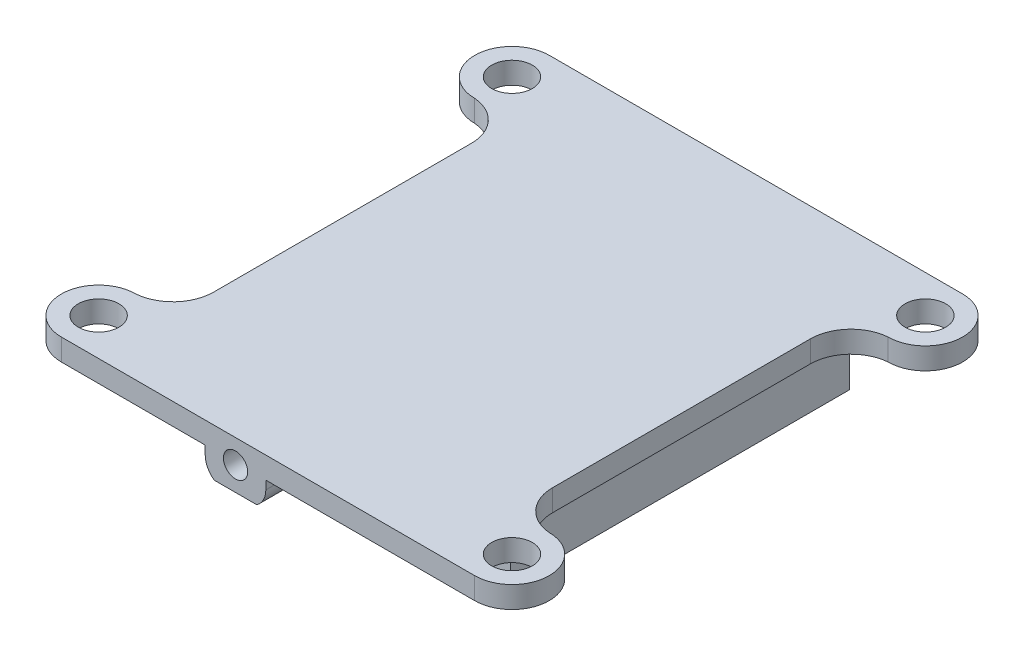
ISO-10303-21;
HEADER;
FILE_DESCRIPTION(('STEP AP214'),'2;1');
FILE_NAME('part.step','',(''),(''),'','','');
FILE_SCHEMA(('AUTOMOTIVE_DESIGN { 1 0 10303 214 1 1 1 1 }'));
ENDSEC;
DATA;
#1=APPLICATION_CONTEXT('core data for automotive mechanical design processes');
#2=APPLICATION_PROTOCOL_DEFINITION('international standard','automotive_design',2000,#1);
#3=PRODUCT_CONTEXT('',#1,'mechanical');
#4=PRODUCT('Part','Part','',(#3));
#5=PRODUCT_RELATED_PRODUCT_CATEGORY('part','',(#4));
#6=PRODUCT_DEFINITION_FORMATION('','',#4);
#7=PRODUCT_DEFINITION_CONTEXT('part definition',#1,'design');
#8=PRODUCT_DEFINITION('design','',#6,#7);
#9=PRODUCT_DEFINITION_SHAPE('','',#8);
#10=(LENGTH_UNIT() NAMED_UNIT(*) SI_UNIT(.MILLI.,.METRE.));
#11=(NAMED_UNIT(*) PLANE_ANGLE_UNIT() SI_UNIT($,.RADIAN.));
#12=(NAMED_UNIT(*) SI_UNIT($,.STERADIAN.) SOLID_ANGLE_UNIT());
#13=UNCERTAINTY_MEASURE_WITH_UNIT(LENGTH_MEASURE(1.E-05),#10,'distance_accuracy_value','');
#14=(GEOMETRIC_REPRESENTATION_CONTEXT(3) GLOBAL_UNCERTAINTY_ASSIGNED_CONTEXT((#13)) GLOBAL_UNIT_ASSIGNED_CONTEXT((#10,
#11,#12)) REPRESENTATION_CONTEXT('',''));
#15=CARTESIAN_POINT('',(0.,0.,0.));
#16=DIRECTION('',(0.,0.,1.));
#17=DIRECTION('',(1.,0.,0.));
#18=AXIS2_PLACEMENT_3D('',#15,#16,#17);
#19=CARTESIAN_POINT('',(0.,-3.2,12.5));
#20=DIRECTION('',(0.,0.,1.));
#21=DIRECTION('',(1.,0.,0.));
#22=AXIS2_PLACEMENT_3D('',#19,#20,#21);
#23=PLANE('',#22);
#24=CARTESIAN_POINT('',(-2.4,-0.15,12.5));
#25=DIRECTION('',(0.,0.,1.));
#26=DIRECTION('',(1.,0.,0.));
#27=AXIS2_PLACEMENT_3D('',#24,#25,#26);
#28=CIRCLE('',#27,0.895817692249954);
#29=CARTESIAN_POINT('',(-1.50418230775005,-0.15,12.5));
#30=VERTEX_POINT('',#29);
#31=EDGE_CURVE('E12',#30,#30,#28,.T.);
#32=ORIENTED_EDGE('',*,*,#31,.T.);
#33=EDGE_LOOP('',(#32));
#34=FACE_BOUND('',#33,.T.);
#35=ADVANCED_FACE('F86',(#34),#23,.T.);
#36=CARTESIAN_POINT('',(0.,0.,0.));
#37=DIRECTION('',(0.,1.,0.));
#38=DIRECTION('',(0.,0.,1.));
#39=AXIS2_PLACEMENT_3D('',#36,#37,#38);
#40=PLANE('',#39);
#41=CARTESIAN_POINT('',(-15.25,0.,15.25));
#42=DIRECTION('',(0.,1.,0.));
#43=DIRECTION('',(0.,0.,1.));
#44=AXIS2_PLACEMENT_3D('',#41,#42,#43);
#45=CIRCLE('',#44,1.5);
#46=CARTESIAN_POINT('',(-15.25,0.,16.75));
#47=VERTEX_POINT('',#46);
#48=EDGE_CURVE('E275',#47,#47,#45,.F.);
#49=ORIENTED_EDGE('',*,*,#48,.F.);
#50=EDGE_LOOP('',(#49));
#51=FACE_BOUND('',#50,.T.);
#52=CARTESIAN_POINT('',(15.25,0.,15.25));
#53=DIRECTION('',(0.,1.,0.));
#54=DIRECTION('',(0.,0.,1.));
#55=AXIS2_PLACEMENT_3D('',#52,#53,#54);
#56=CIRCLE('',#55,1.5);
#57=CARTESIAN_POINT('',(15.25,0.,16.75));
#58=VERTEX_POINT('',#57);
#59=EDGE_CURVE('E272',#58,#58,#56,.T.);
#60=ORIENTED_EDGE('',*,*,#59,.T.);
#61=EDGE_LOOP('',(#60));
#62=FACE_BOUND('',#61,.T.);
#63=CARTESIAN_POINT('',(15.25,0.,-15.25));
#64=DIRECTION('',(0.,1.,0.));
#65=DIRECTION('',(0.,0.,1.));
#66=AXIS2_PLACEMENT_3D('',#63,#64,#65);
#67=CIRCLE('',#66,1.5);
#68=CARTESIAN_POINT('',(15.25,0.,-13.75));
#69=VERTEX_POINT('',#68);
#70=EDGE_CURVE('E269',#69,#69,#67,.F.);
#71=ORIENTED_EDGE('',*,*,#70,.F.);
#72=EDGE_LOOP('',(#71));
#73=FACE_BOUND('',#72,.T.);
#74=CARTESIAN_POINT('',(-15.25,0.,-15.25));
#75=DIRECTION('',(0.,1.,0.));
#76=DIRECTION('',(0.,0.,1.));
#77=AXIS2_PLACEMENT_3D('',#74,#75,#76);
#78=CIRCLE('',#77,1.5);
#79=CARTESIAN_POINT('',(-15.25,0.,-13.75));
#80=VERTEX_POINT('',#79);
#81=EDGE_CURVE('E266',#80,#80,#78,.T.);
#82=ORIENTED_EDGE('',*,*,#81,.T.);
#83=EDGE_LOOP('',(#82));
#84=FACE_BOUND('',#83,.T.);
#85=DIRECTION('',(1.,0.,0.));
#86=VECTOR('',#85,1.);
#87=CARTESIAN_POINT('',(0.,0.,18.));
#88=LINE('',#87,#86);
#89=CARTESIAN_POINT('',(-0.164999999999998,0.,18.));
#90=VERTEX_POINT('',#89);
#91=CARTESIAN_POINT('',(15.25,0.,18.));
#92=VERTEX_POINT('',#91);
#93=EDGE_CURVE('E241',#90,#92,#88,.T.);
#94=ORIENTED_EDGE('',*,*,#93,.F.);
#95=DIRECTION('',(0.,0.,1.));
#96=VECTOR('',#95,1.);
#97=CARTESIAN_POINT('',(-0.164999999999998,0.,6.81660312840991));
#98=LINE('',#97,#96);
#99=CARTESIAN_POINT('',(-0.164999999999998,0.,12.5));
#100=VERTEX_POINT('',#99);
#101=EDGE_CURVE('E385',#100,#90,#98,.T.);
#102=ORIENTED_EDGE('',*,*,#101,.F.);
#103=DIRECTION('',(1.,0.,0.));
#104=VECTOR('',#103,1.);
#105=CARTESIAN_POINT('',(0.,0.,12.5));
#106=LINE('',#105,#104);
#107=CARTESIAN_POINT('',(12.4,0.,12.5));
#108=VERTEX_POINT('',#107);
#109=EDGE_CURVE('E101',#100,#108,#106,.T.);
#110=ORIENTED_EDGE('',*,*,#109,.T.);
#111=DIRECTION('',(0.,0.,1.));
#112=VECTOR('',#111,1.);
#113=CARTESIAN_POINT('',(12.4,0.,0.));
#114=LINE('',#113,#112);
#115=CARTESIAN_POINT('',(12.4,0.,-12.5));
#116=VERTEX_POINT('',#115);
#117=EDGE_CURVE('E412',#116,#108,#114,.T.);
#118=ORIENTED_EDGE('',*,*,#117,.F.);
#119=DIRECTION('',(1.,0.,0.));
#120=VECTOR('',#119,1.);
#121=CARTESIAN_POINT('',(0.,0.,-12.5));
#122=LINE('',#121,#120);
#123=CARTESIAN_POINT('',(-12.4,0.,-12.5));
#124=VERTEX_POINT('',#123);
#125=EDGE_CURVE('E414',#124,#116,#122,.T.);
#126=ORIENTED_EDGE('',*,*,#125,.F.);
#127=DIRECTION('',(0.,0.,1.));
#128=VECTOR('',#127,1.);
#129=CARTESIAN_POINT('',(-12.4,0.,0.));
#130=LINE('',#129,#128);
#131=CARTESIAN_POINT('',(-12.4,0.,12.5));
#132=VERTEX_POINT('',#131);
#133=EDGE_CURVE('E417',#124,#132,#130,.T.);
#134=ORIENTED_EDGE('',*,*,#133,.T.);
#135=CARTESIAN_POINT('',(-4.635,0.,12.5));
#136=VERTEX_POINT('',#135);
#137=EDGE_CURVE('E402',#132,#136,#106,.T.);
#138=ORIENTED_EDGE('',*,*,#137,.T.);
#139=DIRECTION('',(0.,0.,1.));
#140=VECTOR('',#139,1.);
#141=CARTESIAN_POINT('',(-4.635,0.,6.81660312840991));
#142=LINE('',#141,#140);
#143=CARTESIAN_POINT('',(-4.635,0.,18.));
#144=VERTEX_POINT('',#143);
#145=EDGE_CURVE('E382',#136,#144,#142,.T.);
#146=ORIENTED_EDGE('',*,*,#145,.T.);
#147=CARTESIAN_POINT('',(-15.25,0.,18.));
#148=VERTEX_POINT('',#147);
#149=EDGE_CURVE('E242',#148,#144,#88,.T.);
#150=ORIENTED_EDGE('',*,*,#149,.F.);
#151=CARTESIAN_POINT('',(-15.25,0.,15.25));
#152=DIRECTION('',(0.,1.,0.));
#153=DIRECTION('',(0.,0.,1.));
#154=AXIS2_PLACEMENT_3D('',#151,#152,#153);
#155=CIRCLE('',#154,2.75);
#156=CARTESIAN_POINT('',(-15.25,0.,12.5));
#157=VERTEX_POINT('',#156);
#158=EDGE_CURVE('E238',#148,#157,#155,.F.);
#159=ORIENTED_EDGE('',*,*,#158,.T.);
#160=CARTESIAN_POINT('',(-15.5,0.,9.51043481422465));
#161=DIRECTION('',(0.,1.,0.));
#162=DIRECTION('',(0.,0.,1.));
#163=AXIS2_PLACEMENT_3D('',#160,#161,#162);
#164=CIRCLE('',#163,3.);
#165=CARTESIAN_POINT('',(-12.5,0.,9.51043481422465));
#166=VERTEX_POINT('',#165);
#167=EDGE_CURVE('E234',#166,#157,#164,.F.);
#168=ORIENTED_EDGE('',*,*,#167,.F.);
#169=DIRECTION('',(0.,0.,-1.));
#170=VECTOR('',#169,1.);
#171=CARTESIAN_POINT('',(-12.5,0.,0.));
#172=LINE('',#171,#170);
#173=CARTESIAN_POINT('',(-12.5,0.,-9.51043481422465));
#174=VERTEX_POINT('',#173);
#175=EDGE_CURVE('E232',#166,#174,#172,.T.);
#176=ORIENTED_EDGE('',*,*,#175,.T.);
#177=CARTESIAN_POINT('',(-15.5,0.,-9.51043481422465));
#178=DIRECTION('',(0.,1.,0.));
#179=DIRECTION('',(0.,0.,1.));
#180=AXIS2_PLACEMENT_3D('',#177,#178,#179);
#181=CIRCLE('',#180,3.);
#182=CARTESIAN_POINT('',(-15.25,0.,-12.5));
#183=VERTEX_POINT('',#182);
#184=EDGE_CURVE('E263',#174,#183,#181,.T.);
#185=ORIENTED_EDGE('',*,*,#184,.T.);
#186=CARTESIAN_POINT('',(-15.25,0.,-15.25));
#187=DIRECTION('',(0.,1.,0.));
#188=DIRECTION('',(0.,0.,1.));
#189=AXIS2_PLACEMENT_3D('',#186,#187,#188);
#190=CIRCLE('',#189,2.75);
#191=CARTESIAN_POINT('',(-15.25,0.,-18.));
#192=VERTEX_POINT('',#191);
#193=EDGE_CURVE('E261',#192,#183,#190,.T.);
#194=ORIENTED_EDGE('',*,*,#193,.F.);
#195=DIRECTION('',(1.,0.,0.));
#196=VECTOR('',#195,1.);
#197=CARTESIAN_POINT('',(0.,0.,-18.));
#198=LINE('',#197,#196);
#199=CARTESIAN_POINT('',(15.25,0.,-18.));
#200=VERTEX_POINT('',#199);
#201=EDGE_CURVE('E195',#192,#200,#198,.T.);
#202=ORIENTED_EDGE('',*,*,#201,.T.);
#203=CARTESIAN_POINT('',(15.25,0.,-15.25));
#204=DIRECTION('',(0.,1.,0.));
#205=DIRECTION('',(0.,0.,1.));
#206=AXIS2_PLACEMENT_3D('',#203,#204,#205);
#207=CIRCLE('',#206,2.74999999999999);
#208=CARTESIAN_POINT('',(15.25,0.,-12.5));
#209=VERTEX_POINT('',#208);
#210=EDGE_CURVE('E257',#200,#209,#207,.F.);
#211=ORIENTED_EDGE('',*,*,#210,.T.);
#212=CARTESIAN_POINT('',(15.5,0.,-9.51043481422465));
#213=DIRECTION('',(0.,1.,0.));
#214=DIRECTION('',(0.,0.,1.));
#215=AXIS2_PLACEMENT_3D('',#212,#213,#214);
#216=CIRCLE('',#215,3.);
#217=CARTESIAN_POINT('',(12.5,0.,-9.51043481422465));
#218=VERTEX_POINT('',#217);
#219=EDGE_CURVE('E254',#218,#209,#216,.F.);
#220=ORIENTED_EDGE('',*,*,#219,.F.);
#221=DIRECTION('',(0.,0.,-1.));
#222=VECTOR('',#221,1.);
#223=CARTESIAN_POINT('',(12.5,0.,0.));
#224=LINE('',#223,#222);
#225=CARTESIAN_POINT('',(12.5,0.,9.51043481422465));
#226=VERTEX_POINT('',#225);
#227=EDGE_CURVE('E251',#226,#218,#224,.T.);
#228=ORIENTED_EDGE('',*,*,#227,.F.);
#229=CARTESIAN_POINT('',(15.5,0.,9.51043481422465));
#230=DIRECTION('',(0.,1.,0.));
#231=DIRECTION('',(0.,0.,1.));
#232=AXIS2_PLACEMENT_3D('',#229,#230,#231);
#233=CIRCLE('',#232,3.);
#234=CARTESIAN_POINT('',(15.2500000000001,0.,12.5));
#235=VERTEX_POINT('',#234);
#236=EDGE_CURVE('E248',#226,#235,#233,.T.);
#237=ORIENTED_EDGE('',*,*,#236,.T.);
#238=CARTESIAN_POINT('',(15.25,0.,15.25));
#239=DIRECTION('',(0.,1.,0.));
#240=DIRECTION('',(0.,0.,1.));
#241=AXIS2_PLACEMENT_3D('',#238,#239,#240);
#242=CIRCLE('',#241,2.74999999999999);
#243=EDGE_CURVE('E245',#92,#235,#242,.T.);
#244=ORIENTED_EDGE('',*,*,#243,.F.);
#245=EDGE_LOOP('',(#94,#102,#110,#118,#126,#134,#138,#146,#150,#159,#168,#176,#185,#194,#202,
#211,#220,#228,#237,#244));
#246=FACE_BOUND('',#245,.T.);
#247=ADVANCED_FACE('F304',(#51,#62,#73,#84,#246),#40,.F.);
#248=CARTESIAN_POINT('',(-15.25,1.6,15.25));
#249=DIRECTION('',(0.,-1.,0.));
#250=DIRECTION('',(0.,0.,-1.));
#251=AXIS2_PLACEMENT_3D('',#248,#249,#250);
#252=CYLINDRICAL_SURFACE('',#251,1.5);
#253=CARTESIAN_POINT('',(-15.25,1.6,15.25));
#254=DIRECTION('',(0.,1.,0.));
#255=DIRECTION('',(0.,0.,1.));
#256=AXIS2_PLACEMENT_3D('',#253,#254,#255);
#257=CIRCLE('',#256,1.5);
#258=CARTESIAN_POINT('',(-15.25,1.6,16.75));
#259=VERTEX_POINT('',#258);
#260=EDGE_CURVE('E229',#259,#259,#257,.F.);
#261=ORIENTED_EDGE('',*,*,#260,.F.);
#262=EDGE_LOOP('',(#261));
#263=FACE_BOUND('',#262,.T.);
#264=ORIENTED_EDGE('',*,*,#48,.T.);
#265=EDGE_LOOP('',(#264));
#266=FACE_BOUND('',#265,.T.);
#267=ADVANCED_FACE('F323',(#263,#266),#252,.F.);
#268=CARTESIAN_POINT('',(15.25,1.6,15.25));
#269=DIRECTION('',(0.,-1.,0.));
#270=DIRECTION('',(0.,0.,-1.));
#271=AXIS2_PLACEMENT_3D('',#268,#269,#270);
#272=CYLINDRICAL_SURFACE('',#271,1.5);
#273=CARTESIAN_POINT('',(15.25,1.6,15.25));
#274=DIRECTION('',(0.,1.,0.));
#275=DIRECTION('',(0.,0.,1.));
#276=AXIS2_PLACEMENT_3D('',#273,#274,#275);
#277=CIRCLE('',#276,1.5);
#278=CARTESIAN_POINT('',(15.25,1.6,16.75));
#279=VERTEX_POINT('',#278);
#280=EDGE_CURVE('E226',#279,#279,#277,.T.);
#281=ORIENTED_EDGE('',*,*,#280,.T.);
#282=EDGE_LOOP('',(#281));
#283=FACE_BOUND('',#282,.T.);
#284=ORIENTED_EDGE('',*,*,#59,.F.);
#285=EDGE_LOOP('',(#284));
#286=FACE_BOUND('',#285,.T.);
#287=ADVANCED_FACE('F744',(#283,#286),#272,.F.);
#288=CARTESIAN_POINT('',(15.25,1.6,-15.25));
#289=DIRECTION('',(0.,-1.,0.));
#290=DIRECTION('',(0.,0.,-1.));
#291=AXIS2_PLACEMENT_3D('',#288,#289,#290);
#292=CYLINDRICAL_SURFACE('',#291,1.5);
#293=CARTESIAN_POINT('',(15.25,1.6,-15.25));
#294=DIRECTION('',(0.,1.,0.));
#295=DIRECTION('',(0.,0.,1.));
#296=AXIS2_PLACEMENT_3D('',#293,#294,#295);
#297=CIRCLE('',#296,1.5);
#298=CARTESIAN_POINT('',(15.25,1.6,-13.75));
#299=VERTEX_POINT('',#298);
#300=EDGE_CURVE('E223',#299,#299,#297,.F.);
#301=ORIENTED_EDGE('',*,*,#300,.F.);
#302=EDGE_LOOP('',(#301));
#303=FACE_BOUND('',#302,.T.);
#304=ORIENTED_EDGE('',*,*,#70,.T.);
#305=EDGE_LOOP('',(#304));
#306=FACE_BOUND('',#305,.T.);
#307=ADVANCED_FACE('F734',(#303,#306),#292,.F.);
#308=CARTESIAN_POINT('',(-15.25,1.6,-15.25));
#309=DIRECTION('',(0.,-1.,0.));
#310=DIRECTION('',(0.,0.,-1.));
#311=AXIS2_PLACEMENT_3D('',#308,#309,#310);
#312=CYLINDRICAL_SURFACE('',#311,1.5);
#313=CARTESIAN_POINT('',(-15.25,1.6,-15.25));
#314=DIRECTION('',(0.,1.,0.));
#315=DIRECTION('',(0.,0.,1.));
#316=AXIS2_PLACEMENT_3D('',#313,#314,#315);
#317=CIRCLE('',#316,1.5);
#318=CARTESIAN_POINT('',(-15.25,1.6,-13.75));
#319=VERTEX_POINT('',#318);
#320=EDGE_CURVE('E220',#319,#319,#317,.T.);
#321=ORIENTED_EDGE('',*,*,#320,.T.);
#322=EDGE_LOOP('',(#321));
#323=FACE_BOUND('',#322,.T.);
#324=ORIENTED_EDGE('',*,*,#81,.F.);
#325=EDGE_LOOP('',(#324));
#326=FACE_BOUND('',#325,.T.);
#327=ADVANCED_FACE('F726',(#323,#326),#312,.F.);
#328=CARTESIAN_POINT('',(-15.5,1.6,9.51043481422465));
#329=DIRECTION('',(0.,-1.,0.));
#330=DIRECTION('',(0.,0.,-1.));
#331=AXIS2_PLACEMENT_3D('',#328,#329,#330);
#332=CYLINDRICAL_SURFACE('',#331,3.);
#333=ORIENTED_EDGE('',*,*,#167,.T.);
#334=DIRECTION('',(0.,-1.,0.));
#335=VECTOR('',#334,1.);
#336=CARTESIAN_POINT('',(-15.25,1.6,12.5));
#337=LINE('',#336,#335);
#338=CARTESIAN_POINT('',(-15.25,1.6,12.5));
#339=VERTEX_POINT('',#338);
#340=EDGE_CURVE('E296',#339,#157,#337,.T.);
#341=ORIENTED_EDGE('',*,*,#340,.F.);
#342=CARTESIAN_POINT('',(-15.5,1.6,9.51043481422465));
#343=DIRECTION('',(0.,1.,0.));
#344=DIRECTION('',(0.,0.,1.));
#345=AXIS2_PLACEMENT_3D('',#342,#343,#344);
#346=CIRCLE('',#345,3.);
#347=CARTESIAN_POINT('',(-12.5,1.6,9.51043481422465));
#348=VERTEX_POINT('',#347);
#349=EDGE_CURVE('E301',#348,#339,#346,.F.);
#350=ORIENTED_EDGE('',*,*,#349,.F.);
#351=DIRECTION('',(0.,-1.,0.));
#352=VECTOR('',#351,1.);
#353=CARTESIAN_POINT('',(-12.5,1.6,9.51043481422465));
#354=LINE('',#353,#352);
#355=EDGE_CURVE('E94',#348,#166,#354,.T.);
#356=ORIENTED_EDGE('',*,*,#355,.T.);
#357=EDGE_LOOP('',(#333,#341,#350,#356));
#358=FACE_BOUND('',#357,.T.);
#359=ADVANCED_FACE('F299',(#358),#332,.F.);
#360=CARTESIAN_POINT('',(-15.25,1.6,15.25));
#361=DIRECTION('',(0.,-1.,0.));
#362=DIRECTION('',(0.,0.,-1.));
#363=AXIS2_PLACEMENT_3D('',#360,#361,#362);
#364=CYLINDRICAL_SURFACE('',#363,2.75);
#365=ORIENTED_EDGE('',*,*,#158,.F.);
#366=DIRECTION('',(0.,-1.,0.));
#367=VECTOR('',#366,1.);
#368=CARTESIAN_POINT('',(-15.25,1.6,18.));
#369=LINE('',#368,#367);
#370=CARTESIAN_POINT('',(-15.25,1.6,18.));
#371=VERTEX_POINT('',#370);
#372=EDGE_CURVE('E294',#371,#148,#369,.T.);
#373=ORIENTED_EDGE('',*,*,#372,.F.);
#374=CARTESIAN_POINT('',(-15.25,1.6,15.25));
#375=DIRECTION('',(0.,1.,0.));
#376=DIRECTION('',(0.,0.,1.));
#377=AXIS2_PLACEMENT_3D('',#374,#375,#376);
#378=CIRCLE('',#377,2.75);
#379=EDGE_CURVE('E433',#371,#339,#378,.F.);
#380=ORIENTED_EDGE('',*,*,#379,.T.);
#381=ORIENTED_EDGE('',*,*,#340,.T.);
#382=EDGE_LOOP('',(#365,#373,#380,#381));
#383=FACE_BOUND('',#382,.T.);
#384=ADVANCED_FACE('F456',(#383),#364,.T.);
#385=CARTESIAN_POINT('',(0.,1.6,18.));
#386=DIRECTION('',(0.,0.,-1.));
#387=DIRECTION('',(-1.,0.,0.));
#388=AXIS2_PLACEMENT_3D('',#385,#386,#387);
#389=PLANE('',#388);
#390=CARTESIAN_POINT('',(-2.4,-0.15,18.));
#391=DIRECTION('',(0.,0.,1.));
#392=DIRECTION('',(1.,0.,0.));
#393=AXIS2_PLACEMENT_3D('',#390,#391,#392);
#394=CIRCLE('',#393,0.895817692249954);
#395=CARTESIAN_POINT('',(-1.50418230775005,-0.15,18.));
#396=VERTEX_POINT('',#395);
#397=EDGE_CURVE('E363',#396,#396,#394,.T.);
#398=ORIENTED_EDGE('',*,*,#397,.F.);
#399=EDGE_LOOP('',(#398));
#400=FACE_BOUND('',#399,.T.);
#401=ORIENTED_EDGE('',*,*,#149,.T.);
#402=DIRECTION('',(0.,-1.,0.));
#403=VECTOR('',#402,1.);
#404=CARTESIAN_POINT('',(-4.635,0.,18.));
#405=LINE('',#404,#403);
#406=CARTESIAN_POINT('',(-4.635,-0.630150614037566,18.));
#407=VERTEX_POINT('',#406);
#408=EDGE_CURVE('E366',#144,#407,#405,.T.);
#409=ORIENTED_EDGE('',*,*,#408,.T.);
#410=CARTESIAN_POINT('',(-3.07733585232317,-0.630150614037568,18.));
#411=DIRECTION('',(0.,0.,1.));
#412=DIRECTION('',(1.,0.,0.));
#413=AXIS2_PLACEMENT_3D('',#410,#411,#412);
#414=CIRCLE('',#413,1.55766414767683);
#415=CARTESIAN_POINT('',(-3.96520022609282,-1.91,18.));
#416=VERTEX_POINT('',#415);
#417=EDGE_CURVE('E369',#407,#416,#414,.T.);
#418=ORIENTED_EDGE('',*,*,#417,.T.);
#419=DIRECTION('',(1.,0.,0.));
#420=VECTOR('',#419,1.);
#421=CARTESIAN_POINT('',(-3.96520022609282,-1.91,18.));
#422=LINE('',#421,#420);
#423=CARTESIAN_POINT('',(-0.834799773907173,-1.91,18.));
#424=VERTEX_POINT('',#423);
#425=EDGE_CURVE('E372',#416,#424,#422,.T.);
#426=ORIENTED_EDGE('',*,*,#425,.T.);
#427=CARTESIAN_POINT('',(-1.72266414767683,-0.630150614037568,18.));
#428=DIRECTION('',(0.,0.,1.));
#429=DIRECTION('',(-1.,0.,0.));
#430=AXIS2_PLACEMENT_3D('',#427,#428,#429);
#431=CIRCLE('',#430,1.55766414767683);
#432=CARTESIAN_POINT('',(-0.164999999999998,-0.630150614037566,18.));
#433=VERTEX_POINT('',#432);
#434=EDGE_CURVE('E375',#424,#433,#431,.T.);
#435=ORIENTED_EDGE('',*,*,#434,.T.);
#436=DIRECTION('',(0.,1.,0.));
#437=VECTOR('',#436,1.);
#438=CARTESIAN_POINT('',(-0.164999999999998,0.,18.));
#439=LINE('',#438,#437);
#440=EDGE_CURVE('E378',#433,#90,#439,.T.);
#441=ORIENTED_EDGE('',*,*,#440,.T.);
#442=ORIENTED_EDGE('',*,*,#93,.T.);
#443=DIRECTION('',(0.,-1.,0.));
#444=VECTOR('',#443,1.);
#445=CARTESIAN_POINT('',(15.25,1.6,18.));
#446=LINE('',#445,#444);
#447=CARTESIAN_POINT('',(15.25,1.6,18.));
#448=VERTEX_POINT('',#447);
#449=EDGE_CURVE('E291',#448,#92,#446,.T.);
#450=ORIENTED_EDGE('',*,*,#449,.F.);
#451=DIRECTION('',(1.,0.,0.));
#452=VECTOR('',#451,1.);
#453=CARTESIAN_POINT('',(0.,1.6,18.));
#454=LINE('',#453,#452);
#455=EDGE_CURVE('E436',#371,#448,#454,.T.);
#456=ORIENTED_EDGE('',*,*,#455,.F.);
#457=ORIENTED_EDGE('',*,*,#372,.T.);
#458=EDGE_LOOP('',(#401,#409,#418,#426,#435,#441,#442,#450,#456,#457));
#459=FACE_BOUND('',#458,.T.);
#460=ADVANCED_FACE('F460',(#400,#459),#389,.F.);
#461=CARTESIAN_POINT('',(15.25,1.6,15.25));
#462=DIRECTION('',(0.,-1.,0.));
#463=DIRECTION('',(0.,0.,-1.));
#464=AXIS2_PLACEMENT_3D('',#461,#462,#463);
#465=CYLINDRICAL_SURFACE('',#464,2.74999999999999);
#466=ORIENTED_EDGE('',*,*,#243,.T.);
#467=DIRECTION('',(0.,-1.,0.));
#468=VECTOR('',#467,1.);
#469=CARTESIAN_POINT('',(15.2500000000001,1.6,12.5));
#470=LINE('',#469,#468);
#471=CARTESIAN_POINT('',(15.2500000000001,1.6,12.5));
#472=VERTEX_POINT('',#471);
#473=EDGE_CURVE('E289',#472,#235,#470,.T.);
#474=ORIENTED_EDGE('',*,*,#473,.F.);
#475=CARTESIAN_POINT('',(15.25,1.6,15.25));
#476=DIRECTION('',(0.,1.,0.));
#477=DIRECTION('',(0.,0.,1.));
#478=AXIS2_PLACEMENT_3D('',#475,#476,#477);
#479=CIRCLE('',#478,2.74999999999999);
#480=EDGE_CURVE('E438',#448,#472,#479,.T.);
#481=ORIENTED_EDGE('',*,*,#480,.F.);
#482=ORIENTED_EDGE('',*,*,#449,.T.);
#483=EDGE_LOOP('',(#466,#474,#481,#482));
#484=FACE_BOUND('',#483,.T.);
#485=ADVANCED_FACE('F464',(#484),#465,.T.);
#486=CARTESIAN_POINT('',(15.5,1.6,9.51043481422465));
#487=DIRECTION('',(0.,-1.,0.));
#488=DIRECTION('',(0.,0.,-1.));
#489=AXIS2_PLACEMENT_3D('',#486,#487,#488);
#490=CYLINDRICAL_SURFACE('',#489,3.);
#491=ORIENTED_EDGE('',*,*,#236,.F.);
#492=DIRECTION('',(0.,-1.,0.));
#493=VECTOR('',#492,1.);
#494=CARTESIAN_POINT('',(12.5,1.6,9.51043481422465));
#495=LINE('',#494,#493);
#496=CARTESIAN_POINT('',(12.5,1.6,9.51043481422465));
#497=VERTEX_POINT('',#496);
#498=EDGE_CURVE('E287',#497,#226,#495,.T.);
#499=ORIENTED_EDGE('',*,*,#498,.F.);
#500=CARTESIAN_POINT('',(15.5,1.6,9.51043481422465));
#501=DIRECTION('',(0.,1.,0.));
#502=DIRECTION('',(0.,0.,1.));
#503=AXIS2_PLACEMENT_3D('',#500,#501,#502);
#504=CIRCLE('',#503,3.);
#505=EDGE_CURVE('E440',#497,#472,#504,.T.);
#506=ORIENTED_EDGE('',*,*,#505,.T.);
#507=ORIENTED_EDGE('',*,*,#473,.T.);
#508=EDGE_LOOP('',(#491,#499,#506,#507));
#509=FACE_BOUND('',#508,.T.);
#510=ADVANCED_FACE('F468',(#509),#490,.F.);
#511=CARTESIAN_POINT('',(12.5,1.6,0.));
#512=DIRECTION('',(-1.,0.,0.));
#513=DIRECTION('',(0.,0.,1.));
#514=AXIS2_PLACEMENT_3D('',#511,#512,#513);
#515=PLANE('',#514);
#516=ORIENTED_EDGE('',*,*,#227,.T.);
#517=DIRECTION('',(0.,-1.,0.));
#518=VECTOR('',#517,1.);
#519=CARTESIAN_POINT('',(12.5,1.6,-9.51043481422465));
#520=LINE('',#519,#518);
#521=CARTESIAN_POINT('',(12.5,1.6,-9.51043481422465));
#522=VERTEX_POINT('',#521);
#523=EDGE_CURVE('E284',#522,#218,#520,.T.);
#524=ORIENTED_EDGE('',*,*,#523,.F.);
#525=DIRECTION('',(0.,0.,-1.));
#526=VECTOR('',#525,1.);
#527=CARTESIAN_POINT('',(12.5,1.6,0.));
#528=LINE('',#527,#526);
#529=EDGE_CURVE('E443',#497,#522,#528,.T.);
#530=ORIENTED_EDGE('',*,*,#529,.F.);
#531=ORIENTED_EDGE('',*,*,#498,.T.);
#532=EDGE_LOOP('',(#516,#524,#530,#531));
#533=FACE_BOUND('',#532,.T.);
#534=ADVANCED_FACE('F471',(#533),#515,.F.);
#535=CARTESIAN_POINT('',(15.5,1.6,-9.51043481422465));
#536=DIRECTION('',(0.,-1.,0.));
#537=DIRECTION('',(0.,0.,-1.));
#538=AXIS2_PLACEMENT_3D('',#535,#536,#537);
#539=CYLINDRICAL_SURFACE('',#538,3.);
#540=ORIENTED_EDGE('',*,*,#219,.T.);
#541=DIRECTION('',(0.,-1.,0.));
#542=VECTOR('',#541,1.);
#543=CARTESIAN_POINT('',(15.25,1.6,-12.5));
#544=LINE('',#543,#542);
#545=CARTESIAN_POINT('',(15.25,1.6,-12.5));
#546=VERTEX_POINT('',#545);
#547=EDGE_CURVE('E282',#546,#209,#544,.T.);
#548=ORIENTED_EDGE('',*,*,#547,.F.);
#549=CARTESIAN_POINT('',(15.5,1.6,-9.51043481422465));
#550=DIRECTION('',(0.,1.,0.));
#551=DIRECTION('',(0.,0.,1.));
#552=AXIS2_PLACEMENT_3D('',#549,#550,#551);
#553=CIRCLE('',#552,3.);
#554=EDGE_CURVE('E215',#522,#546,#553,.F.);
#555=ORIENTED_EDGE('',*,*,#554,.F.);
#556=ORIENTED_EDGE('',*,*,#523,.T.);
#557=EDGE_LOOP('',(#540,#548,#555,#556));
#558=FACE_BOUND('',#557,.T.);
#559=ADVANCED_FACE('F450',(#558),#539,.F.);
#560=CARTESIAN_POINT('',(15.25,1.6,-15.25));
#561=DIRECTION('',(0.,-1.,0.));
#562=DIRECTION('',(0.,0.,-1.));
#563=AXIS2_PLACEMENT_3D('',#560,#561,#562);
#564=CYLINDRICAL_SURFACE('',#563,2.74999999999999);
#565=ORIENTED_EDGE('',*,*,#210,.F.);
#566=DIRECTION('',(0.,-1.,0.));
#567=VECTOR('',#566,1.);
#568=CARTESIAN_POINT('',(15.25,1.6,-18.));
#569=LINE('',#568,#567);
#570=CARTESIAN_POINT('',(15.25,1.6,-18.));
#571=VERTEX_POINT('',#570);
#572=EDGE_CURVE('E199',#571,#200,#569,.T.);
#573=ORIENTED_EDGE('',*,*,#572,.F.);
#574=CARTESIAN_POINT('',(15.25,1.6,-15.25));
#575=DIRECTION('',(0.,1.,0.));
#576=DIRECTION('',(0.,0.,1.));
#577=AXIS2_PLACEMENT_3D('',#574,#575,#576);
#578=CIRCLE('',#577,2.74999999999999);
#579=EDGE_CURVE('E213',#571,#546,#578,.F.);
#580=ORIENTED_EDGE('',*,*,#579,.T.);
#581=ORIENTED_EDGE('',*,*,#547,.T.);
#582=EDGE_LOOP('',(#565,#573,#580,#581));
#583=FACE_BOUND('',#582,.T.);
#584=ADVANCED_FACE('F453',(#583),#564,.T.);
#585=CARTESIAN_POINT('',(0.,1.6,-18.));
#586=DIRECTION('',(0.,0.,-1.));
#587=DIRECTION('',(-1.,0.,0.));
#588=AXIS2_PLACEMENT_3D('',#585,#586,#587);
#589=PLANE('',#588);
#590=ORIENTED_EDGE('',*,*,#201,.F.);
#591=DIRECTION('',(0.,-1.,0.));
#592=VECTOR('',#591,1.);
#593=CARTESIAN_POINT('',(-15.25,1.6,-18.));
#594=LINE('',#593,#592);
#595=CARTESIAN_POINT('',(-15.25,1.6,-18.));
#596=VERTEX_POINT('',#595);
#597=EDGE_CURVE('E189',#596,#192,#594,.T.);
#598=ORIENTED_EDGE('',*,*,#597,.F.);
#599=DIRECTION('',(1.,0.,0.));
#600=VECTOR('',#599,1.);
#601=CARTESIAN_POINT('',(0.,1.6,-18.));
#602=LINE('',#601,#600);
#603=EDGE_CURVE('E193',#596,#571,#602,.T.);
#604=ORIENTED_EDGE('',*,*,#603,.T.);
#605=ORIENTED_EDGE('',*,*,#572,.T.);
#606=EDGE_LOOP('',(#590,#598,#604,#605));
#607=FACE_BOUND('',#606,.T.);
#608=ADVANCED_FACE('F191',(#607),#589,.T.);
#609=CARTESIAN_POINT('',(-15.25,1.6,-15.25));
#610=DIRECTION('',(0.,-1.,0.));
#611=DIRECTION('',(0.,0.,-1.));
#612=AXIS2_PLACEMENT_3D('',#609,#610,#611);
#613=CYLINDRICAL_SURFACE('',#612,2.75);
#614=ORIENTED_EDGE('',*,*,#193,.T.);
#615=DIRECTION('',(0.,-1.,0.));
#616=VECTOR('',#615,1.);
#617=CARTESIAN_POINT('',(-15.25,1.6,-12.5));
#618=LINE('',#617,#616);
#619=CARTESIAN_POINT('',(-15.25,1.6,-12.5));
#620=VERTEX_POINT('',#619);
#621=EDGE_CURVE('E200',#620,#183,#618,.T.);
#622=ORIENTED_EDGE('',*,*,#621,.F.);
#623=CARTESIAN_POINT('',(-15.25,1.6,-15.25));
#624=DIRECTION('',(0.,1.,0.));
#625=DIRECTION('',(0.,0.,1.));
#626=AXIS2_PLACEMENT_3D('',#623,#624,#625);
#627=CIRCLE('',#626,2.75);
#628=EDGE_CURVE('E203',#596,#620,#627,.T.);
#629=ORIENTED_EDGE('',*,*,#628,.F.);
#630=ORIENTED_EDGE('',*,*,#597,.T.);
#631=EDGE_LOOP('',(#614,#622,#629,#630));
#632=FACE_BOUND('',#631,.T.);
#633=ADVANCED_FACE('F204',(#632),#613,.T.);
#634=CARTESIAN_POINT('',(-15.5,1.6,-9.51043481422465));
#635=DIRECTION('',(0.,-1.,0.));
#636=DIRECTION('',(0.,0.,-1.));
#637=AXIS2_PLACEMENT_3D('',#634,#635,#636);
#638=CYLINDRICAL_SURFACE('',#637,3.);
#639=ORIENTED_EDGE('',*,*,#184,.F.);
#640=DIRECTION('',(0.,-1.,0.));
#641=VECTOR('',#640,1.);
#642=CARTESIAN_POINT('',(-12.5,1.6,-9.51043481422465));
#643=LINE('',#642,#641);
#644=CARTESIAN_POINT('',(-12.5,1.6,-9.51043481422465));
#645=VERTEX_POINT('',#644);
#646=EDGE_CURVE('E110',#645,#174,#643,.T.);
#647=ORIENTED_EDGE('',*,*,#646,.F.);
#648=CARTESIAN_POINT('',(-15.5,1.6,-9.51043481422465));
#649=DIRECTION('',(0.,1.,0.));
#650=DIRECTION('',(0.,0.,1.));
#651=AXIS2_PLACEMENT_3D('',#648,#649,#650);
#652=CIRCLE('',#651,3.);
#653=EDGE_CURVE('E207',#645,#620,#652,.T.);
#654=ORIENTED_EDGE('',*,*,#653,.T.);
#655=ORIENTED_EDGE('',*,*,#621,.T.);
#656=EDGE_LOOP('',(#639,#647,#654,#655));
#657=FACE_BOUND('',#656,.T.);
#658=ADVANCED_FACE('F308',(#657),#638,.F.);
#659=CARTESIAN_POINT('',(-12.5,1.6,0.));
#660=DIRECTION('',(-1.,0.,0.));
#661=DIRECTION('',(0.,0.,1.));
#662=AXIS2_PLACEMENT_3D('',#659,#660,#661);
#663=PLANE('',#662);
#664=ORIENTED_EDGE('',*,*,#175,.F.);
#665=ORIENTED_EDGE('',*,*,#355,.F.);
#666=DIRECTION('',(0.,0.,-1.));
#667=VECTOR('',#666,1.);
#668=CARTESIAN_POINT('',(-12.5,1.6,0.));
#669=LINE('',#668,#667);
#670=EDGE_CURVE('E278',#348,#645,#669,.T.);
#671=ORIENTED_EDGE('',*,*,#670,.T.);
#672=ORIENTED_EDGE('',*,*,#646,.T.);
#673=EDGE_LOOP('',(#664,#665,#671,#672));
#674=FACE_BOUND('',#673,.T.);
#675=ADVANCED_FACE('F88',(#674),#663,.T.);
#676=CARTESIAN_POINT('',(0.,1.6,0.));
#677=DIRECTION('',(0.,1.,0.));
#678=DIRECTION('',(0.,0.,1.));
#679=AXIS2_PLACEMENT_3D('',#676,#677,#678);
#680=PLANE('',#679);
#681=ORIENTED_EDGE('',*,*,#455,.T.);
#682=ORIENTED_EDGE('',*,*,#480,.T.);
#683=ORIENTED_EDGE('',*,*,#505,.F.);
#684=ORIENTED_EDGE('',*,*,#529,.T.);
#685=ORIENTED_EDGE('',*,*,#554,.T.);
#686=ORIENTED_EDGE('',*,*,#579,.F.);
#687=ORIENTED_EDGE('',*,*,#603,.F.);
#688=ORIENTED_EDGE('',*,*,#628,.T.);
#689=ORIENTED_EDGE('',*,*,#653,.F.);
#690=ORIENTED_EDGE('',*,*,#670,.F.);
#691=ORIENTED_EDGE('',*,*,#349,.T.);
#692=ORIENTED_EDGE('',*,*,#379,.F.);
#693=EDGE_LOOP('',(#681,#682,#683,#684,#685,#686,#687,#688,#689,#690,#691,#692));
#694=FACE_BOUND('',#693,.T.);
#695=ORIENTED_EDGE('',*,*,#320,.F.);
#696=EDGE_LOOP('',(#695));
#697=FACE_BOUND('',#696,.T.);
#698=ORIENTED_EDGE('',*,*,#300,.T.);
#699=EDGE_LOOP('',(#698));
#700=FACE_BOUND('',#699,.T.);
#701=ORIENTED_EDGE('',*,*,#280,.F.);
#702=EDGE_LOOP('',(#701));
#703=FACE_BOUND('',#702,.T.);
#704=ORIENTED_EDGE('',*,*,#260,.T.);
#705=EDGE_LOOP('',(#704));
#706=FACE_BOUND('',#705,.T.);
#707=ADVANCED_FACE('F210',(#694,#697,#700,#703,#706),#680,.T.);
#708=CARTESIAN_POINT('',(12.4,-3.2,0.));
#709=DIRECTION('',(-1.,0.,0.));
#710=DIRECTION('',(0.,0.,1.));
#711=AXIS2_PLACEMENT_3D('',#708,#709,#710);
#712=PLANE('',#711);
#713=ORIENTED_EDGE('',*,*,#117,.T.);
#714=DIRECTION('',(0.,1.,0.));
#715=VECTOR('',#714,1.);
#716=CARTESIAN_POINT('',(12.4,-3.2,12.5));
#717=LINE('',#716,#715);
#718=CARTESIAN_POINT('',(12.4,-3.2,12.5));
#719=VERTEX_POINT('',#718);
#720=EDGE_CURVE('E235',#719,#108,#717,.T.);
#721=ORIENTED_EDGE('',*,*,#720,.F.);
#722=DIRECTION('',(0.,0.,1.));
#723=VECTOR('',#722,1.);
#724=CARTESIAN_POINT('',(12.4,-3.2,0.));
#725=LINE('',#724,#723);
#726=CARTESIAN_POINT('',(12.4,-3.2,-12.5));
#727=VERTEX_POINT('',#726);
#728=EDGE_CURVE('E398',#727,#719,#725,.T.);
#729=ORIENTED_EDGE('',*,*,#728,.F.);
#730=DIRECTION('',(0.,1.,0.));
#731=VECTOR('',#730,1.);
#732=CARTESIAN_POINT('',(12.4,-3.2,-12.5));
#733=LINE('',#732,#731);
#734=EDGE_CURVE('E411',#727,#116,#733,.T.);
#735=ORIENTED_EDGE('',*,*,#734,.T.);
#736=EDGE_LOOP('',(#713,#721,#729,#735));
#737=FACE_BOUND('',#736,.T.);
#738=ADVANCED_FACE('F313',(#737),#712,.F.);
#739=DIRECTION('',(0.,-1.,0.));
#740=VECTOR('',#739,1.);
#741=CARTESIAN_POINT('',(-0.164999999999998,0.,12.5));
#742=LINE('',#741,#740);
#743=CARTESIAN_POINT('',(-0.164999999999997,-0.630150614037568,12.5));
#744=VERTEX_POINT('',#743);
#745=EDGE_CURVE('E343',#100,#744,#742,.T.);
#746=ORIENTED_EDGE('',*,*,#745,.T.);
#747=CARTESIAN_POINT('',(-1.72266414767683,-0.630150614037568,12.5));
#748=DIRECTION('',(0.,0.,1.));
#749=DIRECTION('',(1.,0.,0.));
#750=AXIS2_PLACEMENT_3D('',#747,#748,#749);
#751=CIRCLE('',#750,1.55766414767683);
#752=CARTESIAN_POINT('',(-0.834799773907173,-1.91,12.5));
#753=VERTEX_POINT('',#752);
#754=EDGE_CURVE('E347',#744,#753,#751,.F.);
#755=ORIENTED_EDGE('',*,*,#754,.T.);
#756=DIRECTION('',(-1.,0.,0.));
#757=VECTOR('',#756,1.);
#758=CARTESIAN_POINT('',(-3.96520022609282,-1.91,12.5));
#759=LINE('',#758,#757);
#760=CARTESIAN_POINT('',(-3.96520022609282,-1.91,12.5));
#761=VERTEX_POINT('',#760);
#762=EDGE_CURVE('E359',#753,#761,#759,.T.);
#763=ORIENTED_EDGE('',*,*,#762,.T.);
#764=CARTESIAN_POINT('',(-3.07733585232317,-0.630150614037568,12.5));
#765=DIRECTION('',(0.,0.,1.));
#766=DIRECTION('',(1.,0.,0.));
#767=AXIS2_PLACEMENT_3D('',#764,#765,#766);
#768=CIRCLE('',#767,1.55766414767683);
#769=CARTESIAN_POINT('',(-4.635,-0.630150614037566,12.5));
#770=VERTEX_POINT('',#769);
#771=EDGE_CURVE('E357',#761,#770,#768,.F.);
#772=ORIENTED_EDGE('',*,*,#771,.T.);
#773=DIRECTION('',(0.,1.,0.));
#774=VECTOR('',#773,1.);
#775=CARTESIAN_POINT('',(-4.635,0.,12.5));
#776=LINE('',#775,#774);
#777=EDGE_CURVE('E354',#770,#136,#776,.T.);
#778=ORIENTED_EDGE('',*,*,#777,.T.);
#779=ORIENTED_EDGE('',*,*,#137,.F.);
#780=DIRECTION('',(0.,1.,0.));
#781=VECTOR('',#780,1.);
#782=CARTESIAN_POINT('',(-12.4,-3.2,12.5));
#783=LINE('',#782,#781);
#784=CARTESIAN_POINT('',(-12.4,-3.2,12.5));
#785=VERTEX_POINT('',#784);
#786=EDGE_CURVE('E423',#785,#132,#783,.T.);
#787=ORIENTED_EDGE('',*,*,#786,.F.);
#788=DIRECTION('',(1.,0.,0.));
#789=VECTOR('',#788,1.);
#790=CARTESIAN_POINT('',(0.,-3.2,12.5));
#791=LINE('',#790,#789);
#792=EDGE_CURVE('E408',#785,#719,#791,.T.);
#793=ORIENTED_EDGE('',*,*,#792,.T.);
#794=ORIENTED_EDGE('',*,*,#720,.T.);
#795=ORIENTED_EDGE('',*,*,#109,.F.);
#796=EDGE_LOOP('',(#746,#755,#763,#772,#778,#779,#787,#793,#794,#795));
#797=FACE_BOUND('',#796,.T.);
#798=ADVANCED_FACE('F319',(#797),#23,.T.);
#799=CARTESIAN_POINT('',(-12.4,-3.2,0.));
#800=DIRECTION('',(-1.,0.,0.));
#801=DIRECTION('',(0.,0.,1.));
#802=AXIS2_PLACEMENT_3D('',#799,#800,#801);
#803=PLANE('',#802);
#804=ORIENTED_EDGE('',*,*,#133,.F.);
#805=DIRECTION('',(0.,1.,0.));
#806=VECTOR('',#805,1.);
#807=CARTESIAN_POINT('',(-12.4,-3.2,-12.5));
#808=LINE('',#807,#806);
#809=CARTESIAN_POINT('',(-12.4,-3.2,-12.5));
#810=VERTEX_POINT('',#809);
#811=EDGE_CURVE('E426',#810,#124,#808,.T.);
#812=ORIENTED_EDGE('',*,*,#811,.F.);
#813=DIRECTION('',(0.,0.,1.));
#814=VECTOR('',#813,1.);
#815=CARTESIAN_POINT('',(-12.4,-3.2,0.));
#816=LINE('',#815,#814);
#817=EDGE_CURVE('E405',#810,#785,#816,.T.);
#818=ORIENTED_EDGE('',*,*,#817,.T.);
#819=ORIENTED_EDGE('',*,*,#786,.T.);
#820=EDGE_LOOP('',(#804,#812,#818,#819));
#821=FACE_BOUND('',#820,.T.);
#822=ADVANCED_FACE('F329',(#821),#803,.T.);
#823=CARTESIAN_POINT('',(0.,-3.2,-12.5));
#824=DIRECTION('',(0.,0.,1.));
#825=DIRECTION('',(1.,0.,0.));
#826=AXIS2_PLACEMENT_3D('',#823,#824,#825);
#827=PLANE('',#826);
#828=ORIENTED_EDGE('',*,*,#125,.T.);
#829=ORIENTED_EDGE('',*,*,#734,.F.);
#830=DIRECTION('',(1.,0.,0.));
#831=VECTOR('',#830,1.);
#832=CARTESIAN_POINT('',(0.,-3.2,-12.5));
#833=LINE('',#832,#831);
#834=EDGE_CURVE('E401',#810,#727,#833,.T.);
#835=ORIENTED_EDGE('',*,*,#834,.F.);
#836=ORIENTED_EDGE('',*,*,#811,.T.);
#837=EDGE_LOOP('',(#828,#829,#835,#836));
#838=FACE_BOUND('',#837,.T.);
#839=ADVANCED_FACE('F335',(#838),#827,.F.);
#840=CARTESIAN_POINT('',(0.,-3.2,0.));
#841=DIRECTION('',(0.,1.,0.));
#842=DIRECTION('',(0.,0.,1.));
#843=AXIS2_PLACEMENT_3D('',#840,#841,#842);
#844=PLANE('',#843);
#845=ORIENTED_EDGE('',*,*,#728,.T.);
#846=ORIENTED_EDGE('',*,*,#792,.F.);
#847=ORIENTED_EDGE('',*,*,#817,.F.);
#848=ORIENTED_EDGE('',*,*,#834,.T.);
#849=EDGE_LOOP('',(#845,#846,#847,#848));
#850=FACE_BOUND('',#849,.T.);
#851=ADVANCED_FACE('F523',(#850),#844,.F.);
#852=CARTESIAN_POINT('',(-2.4,-0.15,6.81660312840991));
#853=DIRECTION('',(0.,0.,1.));
#854=DIRECTION('',(1.,0.,0.));
#855=AXIS2_PLACEMENT_3D('',#852,#853,#854);
#856=CYLINDRICAL_SURFACE('',#855,0.895817692249954);
#857=CARTESIAN_POINT('',(-1.50418230775005,-0.15,18.));
#858=CARTESIAN_POINT('',(-1.50418230775005,-0.15,17.9427083333333));
#859=CARTESIAN_POINT('',(-1.50418230775005,-0.15,17.8854166666667));
#860=CARTESIAN_POINT('',(-1.50418230775005,-0.15,17.7708333333333));
#861=CARTESIAN_POINT('',(-1.50418230775005,-0.15,17.7135416666667));
#862=CARTESIAN_POINT('',(-1.50418230775005,-0.15,17.5989583333333));
#863=CARTESIAN_POINT('',(-1.50418230775005,-0.15,17.5416666666667));
#864=CARTESIAN_POINT('',(-1.50418230775005,-0.15,17.4270833333333));
#865=CARTESIAN_POINT('',(-1.50418230775005,-0.15,17.3697916666667));
#866=CARTESIAN_POINT('',(-1.50418230775005,-0.15,17.2552083333333));
#867=CARTESIAN_POINT('',(-1.50418230775005,-0.15,17.1979166666667));
#868=CARTESIAN_POINT('',(-1.50418230775005,-0.15,17.0833333333333));
#869=CARTESIAN_POINT('',(-1.50418230775005,-0.15,17.0260416666667));
#870=CARTESIAN_POINT('',(-1.50418230775005,-0.15,16.9114583333333));
#871=CARTESIAN_POINT('',(-1.50418230775005,-0.15,16.8541666666667));
#872=CARTESIAN_POINT('',(-1.50418230775005,-0.15,16.7395833333333));
#873=CARTESIAN_POINT('',(-1.50418230775005,-0.15,16.6822916666667));
#874=CARTESIAN_POINT('',(-1.50418230775005,-0.15,16.5677083333333));
#875=CARTESIAN_POINT('',(-1.50418230775005,-0.15,16.5104166666667));
#876=CARTESIAN_POINT('',(-1.50418230775005,-0.15,16.3958333333333));
#877=CARTESIAN_POINT('',(-1.50418230775005,-0.15,16.3385416666667));
#878=CARTESIAN_POINT('',(-1.50418230775005,-0.15,16.2239583333333));
#879=CARTESIAN_POINT('',(-1.50418230775005,-0.15,16.1666666666667));
#880=CARTESIAN_POINT('',(-1.50418230775005,-0.15,16.0520833333333));
#881=CARTESIAN_POINT('',(-1.50418230775005,-0.15,15.9947916666667));
#882=CARTESIAN_POINT('',(-1.50418230775005,-0.15,15.8802083333333));
#883=CARTESIAN_POINT('',(-1.50418230775005,-0.15,15.8229166666667));
#884=CARTESIAN_POINT('',(-1.50418230775005,-0.15,15.7083333333333));
#885=CARTESIAN_POINT('',(-1.50418230775005,-0.15,15.6510416666667));
#886=CARTESIAN_POINT('',(-1.50418230775005,-0.15,15.5364583333333));
#887=CARTESIAN_POINT('',(-1.50418230775005,-0.15,15.4791666666667));
#888=CARTESIAN_POINT('',(-1.50418230775005,-0.15,15.3645833333333));
#889=CARTESIAN_POINT('',(-1.50418230775005,-0.15,15.3072916666667));
#890=CARTESIAN_POINT('',(-1.50418230775005,-0.15,15.1927083333333));
#891=CARTESIAN_POINT('',(-1.50418230775005,-0.15,15.1354166666667));
#892=CARTESIAN_POINT('',(-1.50418230775005,-0.15,15.0208333333333));
#893=CARTESIAN_POINT('',(-1.50418230775005,-0.15,14.9635416666667));
#894=CARTESIAN_POINT('',(-1.50418230775005,-0.15,14.8489583333333));
#895=CARTESIAN_POINT('',(-1.50418230775005,-0.15,14.7916666666667));
#896=CARTESIAN_POINT('',(-1.50418230775005,-0.15,14.6770833333333));
#897=CARTESIAN_POINT('',(-1.50418230775005,-0.15,14.6197916666667));
#898=CARTESIAN_POINT('',(-1.50418230775005,-0.15,14.5052083333333));
#899=CARTESIAN_POINT('',(-1.50418230775005,-0.15,14.4479166666667));
#900=CARTESIAN_POINT('',(-1.50418230775005,-0.15,14.3333333333333));
#901=CARTESIAN_POINT('',(-1.50418230775005,-0.15,14.2760416666667));
#902=CARTESIAN_POINT('',(-1.50418230775005,-0.15,14.1614583333333));
#903=CARTESIAN_POINT('',(-1.50418230775005,-0.15,14.1041666666667));
#904=CARTESIAN_POINT('',(-1.50418230775005,-0.15,13.9895833333333));
#905=CARTESIAN_POINT('',(-1.50418230775005,-0.15,13.9322916666667));
#906=CARTESIAN_POINT('',(-1.50418230775005,-0.15,13.8177083333333));
#907=CARTESIAN_POINT('',(-1.50418230775005,-0.15,13.7604166666667));
#908=CARTESIAN_POINT('',(-1.50418230775005,-0.15,13.6458333333333));
#909=CARTESIAN_POINT('',(-1.50418230775005,-0.15,13.5885416666667));
#910=CARTESIAN_POINT('',(-1.50418230775005,-0.15,13.4739583333333));
#911=CARTESIAN_POINT('',(-1.50418230775005,-0.15,13.4166666666667));
#912=CARTESIAN_POINT('',(-1.50418230775005,-0.15,13.3020833333333));
#913=CARTESIAN_POINT('',(-1.50418230775005,-0.15,13.2447916666667));
#914=CARTESIAN_POINT('',(-1.50418230775005,-0.15,13.1302083333333));
#915=CARTESIAN_POINT('',(-1.50418230775005,-0.15,13.0729166666667));
#916=CARTESIAN_POINT('',(-1.50418230775005,-0.15,12.9583333333333));
#917=CARTESIAN_POINT('',(-1.50418230775005,-0.15,12.9010416666667));
#918=CARTESIAN_POINT('',(-1.50418230775005,-0.15,12.7864583333333));
#919=CARTESIAN_POINT('',(-1.50418230775005,-0.15,12.7291666666667));
#920=CARTESIAN_POINT('',(-1.50418230775005,-0.15,12.6145833333333));
#921=CARTESIAN_POINT('',(-1.50418230775005,-0.15,12.5572916666667));
#922=CARTESIAN_POINT('',(-1.50418230775005,-0.15,12.5));
#923=B_SPLINE_CURVE_WITH_KNOTS('',3,(#857,#858,#859,#860,#861,#862,#863,#864,#865,#866,#867,
#868,#869,#870,#871,#872,#873,#874,#875,#876,#877,#878,#879,#880,#881,#882,#883,#884,#885,#886,
#887,#888,#889,#890,#891,#892,#893,#894,#895,#896,#897,#898,#899,#900,#901,#902,#903,#904,#905,
#906,#907,#908,#909,#910,#911,#912,#913,#914,#915,#916,#917,#918,#919,#920,#921,#922),
.UNSPECIFIED.,.F.,.F.,(4,2,2,2,2,2,2,2,2,2,2,2,2,2,2,2,2,2,2,2,2,2,2,2,2,2,2,2,2,2,2,2,4),(0.,
0.171875000000002,0.343750000000004,0.515624999999999,0.687500000000001,0.859375000000002,
1.03125,1.203125,1.375,1.546875,1.71875,1.890625,2.0625,2.234375,2.40625,2.578125,2.75,2.921875,
3.09375,3.265625,3.4375,3.609375,3.78125,3.953125,4.125,4.296875,4.46875,4.640625,4.8125,
4.984375,5.15625,5.328125,5.49999999999999),.UNSPECIFIED.);
#924=EDGE_CURVE('BSEAM525',#396,#30,#923,.T.);
#925=ORIENTED_EDGE('',*,*,#397,.T.);
#926=ORIENTED_EDGE('',*,*,#31,.F.);
#927=ORIENTED_EDGE('',*,*,#924,.T.);
#928=ORIENTED_EDGE('',*,*,#924,.F.);
#929=EDGE_LOOP('',(#925,#927,#926,#928));
#930=FACE_BOUND('',#929,.T.);
#931=ADVANCED_FACE('F525',(#930),#856,.F.);
#932=CARTESIAN_POINT('',(-3.07733585232317,-0.630150614037568,6.81660312840991));
#933=DIRECTION('',(0.,0.,1.));
#934=DIRECTION('',(1.,0.,0.));
#935=AXIS2_PLACEMENT_3D('',#932,#933,#934);
#936=CYLINDRICAL_SURFACE('',#935,1.55766414767683);
#937=ORIENTED_EDGE('',*,*,#771,.F.);
#938=DIRECTION('',(0.,0.,1.));
#939=VECTOR('',#938,1.);
#940=CARTESIAN_POINT('',(-3.96520022609282,-1.91,6.81660312840991));
#941=LINE('',#940,#939);
#942=EDGE_CURVE('E393',#761,#416,#941,.T.);
#943=ORIENTED_EDGE('',*,*,#942,.T.);
#944=ORIENTED_EDGE('',*,*,#417,.F.);
#945=DIRECTION('',(0.,0.,1.));
#946=VECTOR('',#945,1.);
#947=CARTESIAN_POINT('',(-4.635,-0.630150614037566,6.81660312840991));
#948=LINE('',#947,#946);
#949=EDGE_CURVE('E381',#770,#407,#948,.T.);
#950=ORIENTED_EDGE('',*,*,#949,.F.);
#951=EDGE_LOOP('',(#937,#943,#944,#950));
#952=FACE_BOUND('',#951,.T.);
#953=ADVANCED_FACE('F530',(#952),#936,.T.);
#954=CARTESIAN_POINT('',(-3.96520022609282,-1.91,6.81660312840991));
#955=DIRECTION('',(0.,-1.,0.));
#956=DIRECTION('',(0.,0.,-1.));
#957=AXIS2_PLACEMENT_3D('',#954,#955,#956);
#958=PLANE('',#957);
#959=ORIENTED_EDGE('',*,*,#762,.F.);
#960=DIRECTION('',(0.,0.,1.));
#961=VECTOR('',#960,1.);
#962=CARTESIAN_POINT('',(-0.834799773907173,-1.91,6.81660312840991));
#963=LINE('',#962,#961);
#964=EDGE_CURVE('E390',#753,#424,#963,.T.);
#965=ORIENTED_EDGE('',*,*,#964,.T.);
#966=ORIENTED_EDGE('',*,*,#425,.F.);
#967=ORIENTED_EDGE('',*,*,#942,.F.);
#968=EDGE_LOOP('',(#959,#965,#966,#967));
#969=FACE_BOUND('',#968,.T.);
#970=ADVANCED_FACE('F541',(#969),#958,.T.);
#971=CARTESIAN_POINT('',(-1.72266414767683,-0.630150614037568,6.81660312840991));
#972=DIRECTION('',(0.,0.,1.));
#973=DIRECTION('',(1.,0.,0.));
#974=AXIS2_PLACEMENT_3D('',#971,#972,#973);
#975=CYLINDRICAL_SURFACE('',#974,1.55766414767683);
#976=ORIENTED_EDGE('',*,*,#754,.F.);
#977=DIRECTION('',(0.,0.,1.));
#978=VECTOR('',#977,1.);
#979=CARTESIAN_POINT('',(-0.164999999999998,-0.630150614037566,6.81660312840991));
#980=LINE('',#979,#978);
#981=EDGE_CURVE('E387',#744,#433,#980,.T.);
#982=ORIENTED_EDGE('',*,*,#981,.T.);
#983=ORIENTED_EDGE('',*,*,#434,.F.);
#984=ORIENTED_EDGE('',*,*,#964,.F.);
#985=EDGE_LOOP('',(#976,#982,#983,#984));
#986=FACE_BOUND('',#985,.T.);
#987=ADVANCED_FACE('F545',(#986),#975,.T.);
#988=CARTESIAN_POINT('',(-0.164999999999998,0.,6.81660312840991));
#989=DIRECTION('',(1.,0.,0.));
#990=DIRECTION('',(0.,1.,0.));
#991=AXIS2_PLACEMENT_3D('',#988,#989,#990);
#992=PLANE('',#991);
#993=ORIENTED_EDGE('',*,*,#745,.F.);
#994=ORIENTED_EDGE('',*,*,#101,.T.);
#995=ORIENTED_EDGE('',*,*,#440,.F.);
#996=ORIENTED_EDGE('',*,*,#981,.F.);
#997=EDGE_LOOP('',(#993,#994,#995,#996));
#998=FACE_BOUND('',#997,.T.);
#999=ADVANCED_FACE('F478',(#998),#992,.T.);
#1000=CARTESIAN_POINT('',(-4.635,0.,6.81660312840991));
#1001=DIRECTION('',(-1.,0.,0.));
#1002=DIRECTION('',(0.,-1.,0.));
#1003=AXIS2_PLACEMENT_3D('',#1000,#1001,#1002);
#1004=PLANE('',#1003);
#1005=ORIENTED_EDGE('',*,*,#777,.F.);
#1006=ORIENTED_EDGE('',*,*,#949,.T.);
#1007=ORIENTED_EDGE('',*,*,#408,.F.);
#1008=ORIENTED_EDGE('',*,*,#145,.F.);
#1009=EDGE_LOOP('',(#1005,#1006,#1007,#1008));
#1010=FACE_BOUND('',#1009,.T.);
#1011=ADVANCED_FACE('F535',(#1010),#1004,.T.);
#1012=CLOSED_SHELL('',(#35,#247,#267,#287,#307,#327,#359,#384,#460,#485,#510,#534,#559,#584,
#608,#633,#658,#675,#707,#738,#798,#822,#839,#851,#931,#953,#970,#987,#999,#1011));
#1013=MANIFOLD_SOLID_BREP('B2',#1012);
#1014=ADVANCED_BREP_SHAPE_REPRESENTATION('',(#18,#1013),#14);
#1015=SHAPE_DEFINITION_REPRESENTATION(#9,#1014);
ENDSEC;
END-ISO-10303-21;
